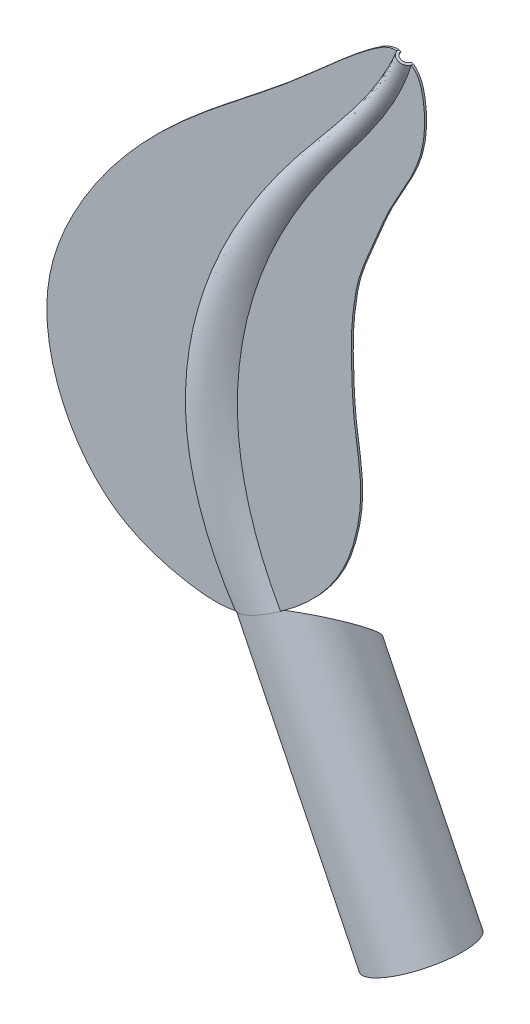
ISO-10303-21;
HEADER;
FILE_DESCRIPTION(('STEP AP214'),'2;1');
FILE_NAME('part.step','',(''),(''),'','','');
FILE_SCHEMA(('AUTOMOTIVE_DESIGN { 1 0 10303 214 1 1 1 1 }'));
ENDSEC;
DATA;
#1=APPLICATION_CONTEXT('core data for automotive mechanical design processes');
#2=APPLICATION_PROTOCOL_DEFINITION('international standard','automotive_design',2000,#1);
#3=PRODUCT_CONTEXT('',#1,'mechanical');
#4=PRODUCT('Part','Part','',(#3));
#5=PRODUCT_RELATED_PRODUCT_CATEGORY('part','',(#4));
#6=PRODUCT_DEFINITION_FORMATION('','',#4);
#7=PRODUCT_DEFINITION_CONTEXT('part definition',#1,'design');
#8=PRODUCT_DEFINITION('design','',#6,#7);
#9=PRODUCT_DEFINITION_SHAPE('','',#8);
#10=(LENGTH_UNIT() NAMED_UNIT(*) SI_UNIT(.MILLI.,.METRE.));
#11=(NAMED_UNIT(*) PLANE_ANGLE_UNIT() SI_UNIT($,.RADIAN.));
#12=(NAMED_UNIT(*) SI_UNIT($,.STERADIAN.) SOLID_ANGLE_UNIT());
#13=UNCERTAINTY_MEASURE_WITH_UNIT(LENGTH_MEASURE(1.E-05),#10,'distance_accuracy_value','');
#14=(GEOMETRIC_REPRESENTATION_CONTEXT(3) GLOBAL_UNCERTAINTY_ASSIGNED_CONTEXT((#13)) GLOBAL_UNIT_ASSIGNED_CONTEXT((#10,
#11,#12)) REPRESENTATION_CONTEXT('',''));
#15=CARTESIAN_POINT('',(0.,0.,0.));
#16=DIRECTION('',(0.,0.,1.));
#17=DIRECTION('',(1.,0.,0.));
#18=AXIS2_PLACEMENT_3D('',#15,#16,#17);
#19=CARTESIAN_POINT('',(1.71023676879806,91.0927998577119,-9.45862081054178));
#20=DIRECTION('',(0.439516642205836,-0.898234446692013,0.));
#21=DIRECTION('',(0.898234446692013,0.439516642205836,0.));
#22=AXIS2_PLACEMENT_3D('',#19,#20,#21);
#23=PLANE('',#22);
#24=CARTESIAN_POINT('',(1.71023676879806,91.0927998577119,-9.45862081054178));
#25=DIRECTION('',(0.439516642205836,-0.898234446692013,0.));
#26=DIRECTION('',(0.898234446692013,0.439516642205836,0.));
#27=AXIS2_PLACEMENT_3D('',#24,#25,#26);
#28=CIRCLE('',#27,11.6091216226183);
#29=CARTESIAN_POINT('',(7.75624190087267,94.0511810289027,0.));
#30=VERTEX_POINT('',#29);
#31=CARTESIAN_POINT('',(7.39283785826073,93.873363171704,0.275248788115344));
#32=VERTEX_POINT('',#31);
#33=EDGE_CURVE('E179',#30,#32,#28,.T.);
#34=ORIENTED_EDGE('',*,*,#33,.F.);
#35=DIRECTION('',(-0.898234446692013,-0.439516642205836,0.));
#36=VECTOR('',#35,1.);
#37=CARTESIAN_POINT('',(90.7586367294848,134.665225618782,0.));
#38=LINE('',#37,#36);
#39=CARTESIAN_POINT('',(7.39283785378464,93.8733631695138,0.));
#40=VERTEX_POINT('',#39);
#41=EDGE_CURVE('E186',#30,#40,#38,.T.);
#42=ORIENTED_EDGE('',*,*,#41,.T.);
#43=DIRECTION('',(0.,0.,1.));
#44=VECTOR('',#43,1.);
#45=CARTESIAN_POINT('',(7.39283785826074,93.873363171704,0.));
#46=LINE('',#45,#44);
#47=EDGE_CURVE('E197',#40,#32,#46,.T.);
#48=ORIENTED_EDGE('',*,*,#47,.T.);
#49=EDGE_LOOP('',(#34,#42,#48));
#50=FACE_BOUND('',#49,.T.);
#51=ADVANCED_FACE('F104',(#50),#23,.F.);
#52=CARTESIAN_POINT('',(-35.6320594824707,72.820776644778,0.));
#53=DIRECTION('',(0.439516642205836,-0.898234446692013,0.));
#54=DIRECTION('',(0.898234446692013,0.439516642205836,0.));
#55=AXIS2_PLACEMENT_3D('',#52,#53,#54);
#56=PLANE('',#55);
#57=DIRECTION('',(0.,0.,-1.));
#58=VECTOR('',#57,1.);
#59=CARTESIAN_POINT('',(-3.9723643206645,88.3122365437197,0.));
#60=LINE('',#59,#58);
#61=CARTESIAN_POINT('',(-3.97236432066456,88.3122365437197,0.500000000000034));
#62=VERTEX_POINT('',#61);
#63=CARTESIAN_POINT('',(-3.9723643206645,88.3122365437197,0.275248788115415));
#64=VERTEX_POINT('',#63);
#65=EDGE_CURVE('E410',#62,#64,#60,.T.);
#66=ORIENTED_EDGE('',*,*,#65,.T.);
#67=EDGE_CURVE('E201',#32,#64,#28,.T.);
#68=ORIENTED_EDGE('',*,*,#67,.F.);
#69=CARTESIAN_POINT('',(7.39283785826068,93.873363171704,0.50000000000005));
#70=VERTEX_POINT('',#69);
#71=EDGE_CURVE('E231',#32,#70,#46,.T.);
#72=ORIENTED_EDGE('',*,*,#71,.T.);
#73=CARTESIAN_POINT('',(1.71023676879807,91.0927998577119,-9.34405469895049));
#74=DIRECTION('',(0.439516642205836,-0.898234446692013,0.));
#75=DIRECTION('',(0.898234446692013,0.439516642205836,0.));
#76=AXIS2_PLACEMENT_3D('',#73,#74,#75);
#77=CIRCLE('',#76,11.7016622922135);
#78=EDGE_CURVE('E253',#70,#62,#77,.T.);
#79=ORIENTED_EDGE('',*,*,#78,.T.);
#80=EDGE_LOOP('',(#66,#68,#72,#79));
#81=FACE_BOUND('',#80,.T.);
#82=ADVANCED_FACE('F368',(#81),#56,.T.);
#83=CARTESIAN_POINT('',(18.1526389048694,217.653213219474,0.));
#84=DIRECTION('',(0.,0.,1.));
#85=DIRECTION('',(1.,0.,0.));
#86=AXIS2_PLACEMENT_3D('',#83,#84,#85);
#87=PLANE('',#86);
#88=DIRECTION('',(0.898234446692013,0.439516642205836,0.));
#89=VECTOR('',#88,1.);
#90=CARTESIAN_POINT('',(-35.6320594824707,72.820776644778,0.));
#91=LINE('',#90,#89);
#92=CARTESIAN_POINT('',(6.94372063491476,93.6536048506011,0.));
#93=VERTEX_POINT('',#92);
#94=EDGE_CURVE('E191',#93,#40,#91,.T.);
#95=ORIENTED_EDGE('',*,*,#94,.F.);
#96=CARTESIAN_POINT('',(6.9437206349147,93.6536048506011,0.));
#97=CARTESIAN_POINT('',(5.41473395810933,96.3545809820254,0.));
#98=CARTESIAN_POINT('',(1.24194154709839,104.707541272413,1.44641660090207E-13));
#99=CARTESIAN_POINT('',(-2.49634591720829,116.679375194456,2.37172736428908E-13));
#100=CARTESIAN_POINT('',(-4.42143577962569,132.163197025344,3.52836581852284E-13));
#101=CARTESIAN_POINT('',(-3.34558290588977,147.844061243657,4.68462871494197E-13));
#102=CARTESIAN_POINT('',(1.85817524431581,166.029164092732,6.07231319166151E-13));
#103=CARTESIAN_POINT('',(10.1097099710725,182.747803811294,7.46009155783471E-13));
#104=CARTESIAN_POINT('',(18.8175917292774,195.677660467372,8.61710556988309E-13));
#105=CARTESIAN_POINT('',(28.2324327476993,208.012194035582,9.773978747751E-13));
#106=CARTESIAN_POINT('',(34.4172254584816,216.784470937884,1.05837899722585E-12));
#107=CARTESIAN_POINT('',(38.2925567593176,225.081245171922,1.12777730447988E-12));
#108=CARTESIAN_POINT('',(39.3660267458507,228.004631883273,1.15091476803724E-12));
#109=CARTESIAN_POINT('',(39.8290754678166,229.480921643533,1.16248349981591E-12));
#110=B_SPLINE_CURVE_WITH_KNOTS('',3,(#96,#97,#98,#99,#100,#101,#102,#103,#104,#105,#106,#107,
#108,#109),.UNSPECIFIED.,.F.,.F.,(4,1,1,1,1,1,1,1,1,1,1,4),(0.,0.0625,0.1875,0.25,0.375,
0.499898531977178,0.624923898982884,0.749949265988589,0.8125,0.937487316497147,
0.968743658248574,1.),.UNSPECIFIED.);
#111=CARTESIAN_POINT('',(39.8290754678166,229.480921643533,1.16248349981591E-12));
#112=VERTEX_POINT('',#111);
#113=EDGE_CURVE('E241',#112,#93,#110,.F.);
#114=ORIENTED_EDGE('',*,*,#113,.F.);
#115=DIRECTION('',(-0.939366733979565,0.342914186193229,0.));
#116=VECTOR('',#115,1.);
#117=CARTESIAN_POINT('',(40.2987588348063,229.309464550437,0.));
#118=LINE('',#117,#116);
#119=CARTESIAN_POINT('',(40.2987588884533,229.309464510191,0.));
#120=VERTEX_POINT('',#119);
#121=EDGE_CURVE('E366',#120,#112,#118,.T.);
#122=ORIENTED_EDGE('',*,*,#121,.F.);
#123=CARTESIAN_POINT('',(-3.97236432066451,88.3122365437197,0.));
#124=CARTESIAN_POINT('',(0.0835084057310594,89.1900810170922,0.));
#125=CARTESIAN_POINT('',(11.0213808384203,95.5353269658342,0.));
#126=CARTESIAN_POINT('',(21.9576734377895,106.378915959256,0.));
#127=CARTESIAN_POINT('',(26.4780846819235,119.575989795111,0.));
#128=CARTESIAN_POINT('',(27.9632290482625,128.392364103159,0.));
#129=CARTESIAN_POINT('',(27.0292993226862,137.517591070725,0.));
#130=CARTESIAN_POINT('',(25.6538800577086,145.658760462885,0.));
#131=CARTESIAN_POINT('',(25.2658226417589,155.050759971534,0.));
#132=CARTESIAN_POINT('',(24.9926379538767,162.930912241937,0.));
#133=CARTESIAN_POINT('',(25.871682132877,170.086342226938,0.));
#134=CARTESIAN_POINT('',(26.8815903040995,177.049885165787,0.));
#135=CARTESIAN_POINT('',(30.719887523617,185.097493097323,0.));
#136=CARTESIAN_POINT('',(34.608540075814,195.450511590628,0.));
#137=CARTESIAN_POINT('',(39.5751521784441,203.079883121232,0.));
#138=CARTESIAN_POINT('',(42.7634298561079,210.557224289062,0.));
#139=CARTESIAN_POINT('',(43.7769597250773,216.669640915734,0.));
#140=CARTESIAN_POINT('',(43.5371616425588,222.776107870919,0.));
#141=CARTESIAN_POINT('',(42.1271190617327,228.764345056572,0.));
#142=CARTESIAN_POINT('',(36.018113251844,231.663027755294,0.));
#143=CARTESIAN_POINT('',(29.3034744520608,227.213853019865,0.));
#144=CARTESIAN_POINT('',(21.0611956265141,220.350444736864,0.));
#145=CARTESIAN_POINT('',(6.03291939901175,206.619219690843,0.));
#146=CARTESIAN_POINT('',(-18.745935465649,188.747565485561,0.));
#147=CARTESIAN_POINT('',(-41.6770805771715,163.49811028959,0.));
#148=CARTESIAN_POINT('',(-53.9505634180973,133.903950419937,0.));
#149=CARTESIAN_POINT('',(-48.4412005163846,109.979062643897,0.));
#150=CARTESIAN_POINT('',(-34.3894596578642,93.4127484566212,0.));
#151=CARTESIAN_POINT('',(-18.3876763460696,88.3977441064224,0.));
#152=CARTESIAN_POINT('',(-7.90293042245715,87.4615131698751,0.));
#153=CARTESIAN_POINT('',(-3.97236432066451,88.3122365437197,0.));
#154=B_SPLINE_CURVE_WITH_KNOTS('',3,(#123,#124,#125,#126,#127,#128,#129,#130,#131,#132,#133,
#134,#135,#136,#137,#138,#139,#140,#141,#142,#143,#144,#145,#146,#147,#148,#149,#150,#151,#152,
#153),.UNSPECIFIED.,.T.,.F.,(4,1,1,1,1,1,1,1,1,1,1,1,1,1,1,1,1,1,1,1,1,1,1,1,1,1,1,1,4),(0.,
0.0340243763582733,0.0988763297607311,0.118907677478479,0.145786062529137,0.170286406352009,
0.192462457471315,0.212381064659587,0.246064292787529,0.255799531100637,0.270542838998359,
0.302555902042624,0.326969861183771,0.359688752491897,0.375550629104661,0.392265066976641,
0.408966518276035,0.425441242525256,0.438507929679372,0.456211432649759,0.484640685623077,
0.527742356255112,0.618785571803741,0.731634369678768,0.798927425070733,0.868192529540393,
0.917781462234963,0.967026810412931,1.),.UNSPECIFIED.);
#155=EDGE_CURVE('E409',#40,#120,#154,.T.);
#156=ORIENTED_EDGE('',*,*,#155,.F.);
#157=EDGE_LOOP('',(#95,#114,#122,#156));
#158=FACE_BOUND('',#157,.T.);
#159=ADVANCED_FACE('F377',(#158),#87,.F.);
#160=CARTESIAN_POINT('',(18.1526389048694,217.653213219474,0.5));
#161=DIRECTION('',(0.,0.,1.));
#162=DIRECTION('',(1.,0.,0.));
#163=AXIS2_PLACEMENT_3D('',#160,#161,#162);
#164=PLANE('',#163);
#165=CARTESIAN_POINT('',(7.39283785826068,93.873363171704,0.500000000000049));
#166=CARTESIAN_POINT('',(1.95170172899969,103.47520103635,0.5));
#167=CARTESIAN_POINT('',(-2.15269592452179,115.337754887318,0.5));
#168=CARTESIAN_POINT('',(-3.78743288323208,133.69323217994,0.5));
#169=CARTESIAN_POINT('',(-2.95945882534134,146.840599525724,0.5));
#170=CARTESIAN_POINT('',(3.49899202524205,170.553491291259,0.5));
#171=CARTESIAN_POINT('',(19.4443984325725,197.472204926412,0.5));
#172=CARTESIAN_POINT('',(36.3267385991195,216.645915282065,0.5));
#173=CARTESIAN_POINT('',(40.2987588348063,229.309464550437,0.5));
#174=B_SPLINE_CURVE_WITH_KNOTS('',3,(#165,#166,#167,#168,#169,#170,#171,#172,#173),
.UNSPECIFIED.,.F.,.F.,(4,1,1,1,1,1,4),(0.,0.224028164890013,0.247391799255593,0.372145457266583,
0.487607511807965,0.737136412327062,1.),.UNSPECIFIED.);
#175=CARTESIAN_POINT('',(40.2987588348063,229.309464550437,0.5));
#176=VERTEX_POINT('',#175);
#177=EDGE_CURVE('E432',#70,#176,#174,.T.);
#178=ORIENTED_EDGE('',*,*,#177,.F.);
#179=CARTESIAN_POINT('',(-3.97236432066451,88.3122365437197,0.5));
#180=CARTESIAN_POINT('',(0.0835084057310594,89.1900810170922,0.5));
#181=CARTESIAN_POINT('',(11.0213808384203,95.5353269658342,0.5));
#182=CARTESIAN_POINT('',(21.9576734377895,106.378915959256,0.5));
#183=CARTESIAN_POINT('',(26.4780846819235,119.575989795111,0.5));
#184=CARTESIAN_POINT('',(27.9632290482625,128.392364103159,0.5));
#185=CARTESIAN_POINT('',(27.0292993226862,137.517591070725,0.5));
#186=CARTESIAN_POINT('',(25.6538800577086,145.658760462885,0.5));
#187=CARTESIAN_POINT('',(25.2658226417589,155.050759971534,0.5));
#188=CARTESIAN_POINT('',(24.9926379538767,162.930912241937,0.5));
#189=CARTESIAN_POINT('',(25.871682132877,170.086342226938,0.5));
#190=CARTESIAN_POINT('',(26.8815903040995,177.049885165787,0.5));
#191=CARTESIAN_POINT('',(30.719887523617,185.097493097323,0.5));
#192=CARTESIAN_POINT('',(34.608540075814,195.450511590628,0.5));
#193=CARTESIAN_POINT('',(39.5751521784441,203.079883121232,0.5));
#194=CARTESIAN_POINT('',(42.7634298561079,210.557224289062,0.5));
#195=CARTESIAN_POINT('',(43.7769597250773,216.669640915734,0.5));
#196=CARTESIAN_POINT('',(43.5371616425588,222.776107870919,0.5));
#197=CARTESIAN_POINT('',(42.1271190617327,228.764345056572,0.5));
#198=CARTESIAN_POINT('',(36.018113251844,231.663027755294,0.5));
#199=CARTESIAN_POINT('',(29.3034744520608,227.213853019865,0.5));
#200=CARTESIAN_POINT('',(21.0611956265141,220.350444736864,0.5));
#201=CARTESIAN_POINT('',(6.03291939901175,206.619219690843,0.5));
#202=CARTESIAN_POINT('',(-18.745935465649,188.747565485561,0.5));
#203=CARTESIAN_POINT('',(-41.6770805771715,163.49811028959,0.5));
#204=CARTESIAN_POINT('',(-53.9505634180973,133.903950419937,0.5));
#205=CARTESIAN_POINT('',(-48.4412005163846,109.979062643897,0.5));
#206=CARTESIAN_POINT('',(-34.3894596578642,93.4127484566212,0.5));
#207=CARTESIAN_POINT('',(-18.3876763460696,88.3977441064224,0.5));
#208=CARTESIAN_POINT('',(-7.90293042245715,87.4615131698751,0.5));
#209=CARTESIAN_POINT('',(-3.97236432066451,88.3122365437197,0.5));
#210=B_SPLINE_CURVE_WITH_KNOTS('',3,(#179,#180,#181,#182,#183,#184,#185,#186,#187,#188,#189,
#190,#191,#192,#193,#194,#195,#196,#197,#198,#199,#200,#201,#202,#203,#204,#205,#206,#207,#208,
#209),.UNSPECIFIED.,.T.,.F.,(4,1,1,1,1,1,1,1,1,1,1,1,1,1,1,1,1,1,1,1,1,1,1,1,1,1,1,1,4),(0.,
0.0340243763582733,0.0988763297607311,0.118907677478479,0.145786062529137,0.170286406352009,
0.192462457471315,0.212381064659587,0.246064292787529,0.255799531100637,0.270542838998359,
0.302555902042624,0.326969861183771,0.359688752491897,0.375550629104661,0.392265066976641,
0.408966518276035,0.425441242525256,0.438507929679372,0.456211432649759,0.484640685623077,
0.527742356255112,0.618785571803741,0.731634369678768,0.798927425070733,0.868192529540393,
0.917781462234963,0.967026810412931,1.),.UNSPECIFIED.);
#211=EDGE_CURVE('E116',#70,#176,#210,.T.);
#212=ORIENTED_EDGE('',*,*,#211,.T.);
#213=EDGE_LOOP('',(#178,#212));
#214=FACE_BOUND('',#213,.T.);
#215=ADVANCED_FACE('F383',(#214),#164,.T.);
#216=DIRECTION('',(0.,0.,-1.));
#217=VECTOR('',#216,1.);
#218=SURFACE_OF_LINEAR_EXTRUSION('',#210,#217);
#219=DIRECTION('',(0.,0.,-1.));
#220=VECTOR('',#219,1.);
#221=CARTESIAN_POINT('',(40.2987588348063,229.309464550437,0.5));
#222=LINE('',#221,#220);
#223=EDGE_CURVE('E132',#176,#120,#222,.T.);
#224=ORIENTED_EDGE('',*,*,#223,.F.);
#225=ORIENTED_EDGE('',*,*,#211,.F.);
#226=ORIENTED_EDGE('',*,*,#71,.F.);
#227=ORIENTED_EDGE('',*,*,#47,.F.);
#228=ORIENTED_EDGE('',*,*,#155,.T.);
#229=EDGE_LOOP('',(#224,#225,#226,#227,#228));
#230=FACE_BOUND('',#229,.T.);
#231=ADVANCED_FACE('F106',(#230),#218,.F.);
#232=DIRECTION('',(0.,-1.11022302462516E-13,1.));
#233=VECTOR('',#232,1.);
#234=CARTESIAN_POINT('',(36.7057979215836,230.621068658837,0.));
#235=LINE('',#234,#233);
#236=CARTESIAN_POINT('',(36.7057979215836,230.621068658837,0.));
#237=VERTEX_POINT('',#236);
#238=CARTESIAN_POINT('',(36.7057979215836,230.621068658837,0.5));
#239=VERTEX_POINT('',#238);
#240=EDGE_CURVE('E396',#237,#239,#235,.T.);
#241=ORIENTED_EDGE('',*,*,#240,.F.);
#242=CARTESIAN_POINT('',(-3.97236432066453,88.3122365437198,0.));
#243=VERTEX_POINT('',#242);
#244=EDGE_CURVE('E593',#237,#243,#154,.T.);
#245=ORIENTED_EDGE('',*,*,#244,.T.);
#246=DIRECTION('',(0.,0.,-1.));
#247=VECTOR('',#246,1.);
#248=CARTESIAN_POINT('',(-3.9723643206645,88.3122365437197,0.5));
#249=LINE('',#248,#247);
#250=EDGE_CURVE('E213',#64,#243,#249,.T.);
#251=ORIENTED_EDGE('',*,*,#250,.F.);
#252=ORIENTED_EDGE('',*,*,#65,.F.);
#253=EDGE_CURVE('E406',#239,#62,#210,.T.);
#254=ORIENTED_EDGE('',*,*,#253,.F.);
#255=EDGE_LOOP('',(#241,#245,#251,#252,#254));
#256=FACE_BOUND('',#255,.T.);
#257=ADVANCED_FACE('F381',(#256),#218,.F.);
#258=CARTESIAN_POINT('',(36.7057979215836,230.621068658837,0.5));
#259=CARTESIAN_POINT('',(31.0799627994331,217.336154588316,0.5));
#260=CARTESIAN_POINT('',(12.3708014878055,197.997819932966,0.5));
#261=CARTESIAN_POINT('',(-6.76999517409408,169.508411826677,0.5));
#262=CARTESIAN_POINT('',(-15.2768659520018,144.842235577833,0.5));
#263=CARTESIAN_POINT('',(-16.8717890563648,130.737424532348,0.5));
#264=CARTESIAN_POINT('',(-15.5630156941021,110.964585378096,0.5));
#265=CARTESIAN_POINT('',(-10.5391912348823,98.1570283038052,0.5));
#266=CARTESIAN_POINT('',(-3.97236432066456,88.3122365437197,0.500000000000037));
#267=B_SPLINE_CURVE_WITH_KNOTS('',3,(#258,#259,#260,#261,#262,#263,#264,#265,#266),
.UNSPECIFIED.,.F.,.F.,(4,1,1,1,1,1,4),(0.,0.262863587672938,0.512392488192035,0.627854542733417,
0.752608200744407,0.775971835109986,1.),.UNSPECIFIED.);
#268=EDGE_CURVE('E272',#239,#62,#267,.T.);
#269=ORIENTED_EDGE('',*,*,#268,.F.);
#270=ORIENTED_EDGE('',*,*,#253,.T.);
#271=EDGE_LOOP('',(#269,#270));
#272=FACE_BOUND('',#271,.T.);
#273=ADVANCED_FACE('F378',(#272),#164,.T.);
#274=CARTESIAN_POINT('',(37.1754812885733,230.44961156574,0.));
#275=VERTEX_POINT('',#274);
#276=EDGE_CURVE('E247',#275,#237,#118,.T.);
#277=ORIENTED_EDGE('',*,*,#276,.F.);
#278=CARTESIAN_POINT('',(-3.52324709731856,88.5319948648226,0.));
#279=CARTESIAN_POINT('',(-5.35437250467209,91.2781092925861,0.));
#280=CARTESIAN_POINT('',(-10.3275530704669,99.8445249750385,1.41152548245033E-13));
#281=CARTESIAN_POINT('',(-14.7751627356351,112.569480136111,2.34472830983118E-13));
#282=CARTESIAN_POINT('',(-16.5834306173817,129.027601468996,3.51123184405725E-13));
#283=CARTESIAN_POINT('',(-14.6032081958552,145.634157674095,4.67735661730017E-13));
#284=CARTESIAN_POINT('',(-7.87355453767895,164.352575211917,6.07687678763409E-13));
#285=CARTESIAN_POINT('',(2.10549464154312,181.831702356315,7.4764916482138E-13));
#286=CARTESIAN_POINT('',(12.2130840799703,195.26472141745,8.64337394342301E-13));
#287=CARTESIAN_POINT('',(22.9056877816002,207.93596847194,9.81011420326354E-13));
#288=CARTESIAN_POINT('',(30.0863009512381,217.005735529305,1.06268323851519E-12));
#289=CARTESIAN_POINT('',(35.0370069991375,225.758781714173,1.13267345056876E-12));
#290=CARTESIAN_POINT('',(36.5092855940238,228.875014993461,1.15600825576557E-12));
#291=CARTESIAN_POINT('',(37.1754812885734,230.44961156574,1.16767565836397E-12));
#292=B_SPLINE_CURVE_WITH_KNOTS('',3,(#278,#279,#280,#281,#282,#283,#284,#285,#286,#287,#288,
#289,#290,#291),.UNSPECIFIED.,.F.,.F.,(4,1,1,1,1,1,1,1,1,1,1,4),(0.,0.0625,0.1875,0.25,0.375,
0.499898531977178,0.624923898982884,0.749949265988589,0.8125,0.937487316497147,
0.968743658248574,1.),.UNSPECIFIED.);
#293=CARTESIAN_POINT('',(-3.52324709731856,88.5319948648226,0.));
#294=VERTEX_POINT('',#293);
#295=EDGE_CURVE('E124',#294,#275,#292,.T.);
#296=ORIENTED_EDGE('',*,*,#295,.F.);
#297=EDGE_CURVE('E225',#243,#294,#91,.T.);
#298=ORIENTED_EDGE('',*,*,#297,.F.);
#299=ORIENTED_EDGE('',*,*,#244,.F.);
#300=EDGE_LOOP('',(#277,#296,#298,#299));
#301=FACE_BOUND('',#300,.T.);
#302=ADVANCED_FACE('F246',(#301),#87,.F.);
#303=CARTESIAN_POINT('',(78.604401070374,215.326056730394,1.09085519881499E-12));
#304=DIRECTION('',(0.342914186193217,0.93936673397957,0.));
#305=DIRECTION('',(-0.93936673397957,0.342914186193217,0.));
#306=AXIS2_PLACEMENT_3D('',#303,#304,#305);
#307=PLANE('',#306);
#308=CARTESIAN_POINT('',(38.502278378195,229.965266604637,-0.12507130457977));
#309=DIRECTION('',(0.342914186193217,0.93936673397957,0.));
#310=DIRECTION('',(-0.93936673397957,0.342914186193217,0.));
#311=AXIS2_PLACEMENT_3D('',#308,#309,#310);
#312=CIRCLE('',#311,1.41796452339407);
#313=EDGE_CURVE('E249',#275,#112,#312,.T.);
#314=ORIENTED_EDGE('',*,*,#313,.F.);
#315=ORIENTED_EDGE('',*,*,#276,.T.);
#316=ORIENTED_EDGE('',*,*,#240,.T.);
#317=CARTESIAN_POINT('',(38.502278378195,229.965266604637,0.0308605449068251));
#318=DIRECTION('',(0.342914186193217,0.93936673397957,0.));
#319=DIRECTION('',(-0.93936673397957,0.342914186193217,0.));
#320=AXIS2_PLACEMENT_3D('',#317,#318,#319);
#321=CIRCLE('',#320,1.96913945509317);
#322=EDGE_CURVE('E333',#239,#176,#321,.T.);
#323=ORIENTED_EDGE('',*,*,#322,.T.);
#324=ORIENTED_EDGE('',*,*,#223,.T.);
#325=ORIENTED_EDGE('',*,*,#121,.T.);
#326=EDGE_LOOP('',(#314,#315,#316,#323,#324,#325));
#327=FACE_BOUND('',#326,.T.);
#328=ADVANCED_FACE('F305',(#327),#307,.T.);
#329=CARTESIAN_POINT('',(-3.97236432066456,88.3122365437197,0.500000000000037));
#330=CARTESIAN_POINT('',(-10.5391912348823,98.1570283038052,0.5));
#331=CARTESIAN_POINT('',(-15.5630156941021,110.964585378096,0.5));
#332=CARTESIAN_POINT('',(-16.8717890563648,130.737424532348,0.5));
#333=CARTESIAN_POINT('',(-15.2768659520018,144.842235577833,0.5));
#334=CARTESIAN_POINT('',(-6.76999517409408,169.508411826677,0.5));
#335=CARTESIAN_POINT('',(12.3708014878055,197.997819932966,0.5));
#336=CARTESIAN_POINT('',(31.0799627994331,217.336154588316,0.5));
#337=CARTESIAN_POINT('',(36.7057979215836,230.621068658837,0.5));
#338=CARTESIAN_POINT('',(-3.53972545179247,88.5239318128498,0.809541779264035));
#339=CARTESIAN_POINT('',(-10.0639855195755,98.3627938304386,0.80286259202201));
#340=CARTESIAN_POINT('',(-15.054289758823,111.135606425044,0.795486840182185));
#341=CARTESIAN_POINT('',(-16.3838492600288,130.856354616005,0.784391676359552));
#342=CARTESIAN_POINT('',(-14.8259849691314,144.926205825498,0.776533308140315));
#343=CARTESIAN_POINT('',(-6.41394593290178,169.561828877558,0.761932037031993));
#344=CARTESIAN_POINT('',(12.5815549022846,197.997543498566,0.743213149370223));
#345=CARTESIAN_POINT('',(31.2046793171377,217.338609718747,0.727936653347044));
#346=CARTESIAN_POINT('',(36.756516738793,230.602553843165,0.720099624810788));
#347=CARTESIAN_POINT('',(-2.64376429761094,88.962336106387,1.35123989297603));
#348=CARTESIAN_POINT('',(-9.08021503990424,98.7864042948664,1.33454675960632));
#349=CARTESIAN_POINT('',(-14.0005241680014,111.486487566681,1.31611271895092));
#350=CARTESIAN_POINT('',(-15.3672113071728,131.098179431301,1.28838284063799));
#351=CARTESIAN_POINT('',(-13.8803166394769,145.094658579215,1.26874260837633));
#352=CARTESIAN_POINT('',(-5.65209192624,169.662760512021,1.23224999974788));
#353=CARTESIAN_POINT('',(13.0603159023806,197.982864458612,1.185466330276));
#354=CARTESIAN_POINT('',(31.5174861741156,217.322682438553,1.14728614812253));
#355=CARTESIAN_POINT('',(36.9244676499925,230.541243656258,1.12769924962158));
#356=CARTESIAN_POINT('',(-1.23078487935462,89.6537234960658,1.93163072909603));
#357=CARTESIAN_POINT('',(-7.52830070938849,99.4485603346994,1.90743801428496));
#358=CARTESIAN_POINT('',(-12.3356431850443,112.031774759591,1.88072226964224));
#359=CARTESIAN_POINT('',(-13.7460267086946,131.468186598078,1.8405344257598));
#360=CARTESIAN_POINT('',(-12.3570907295649,145.346324059547,1.8120705941108));
#361=CARTESIAN_POINT('',(-4.38880194704859,169.797752949837,1.75918326291254));
#362=CARTESIAN_POINT('',(13.9192035144679,197.92470909538,1.69138149386883));
#363=CARTESIAN_POINT('',(32.1439581164795,217.246551589169,1.6360484274027));
#364=CARTESIAN_POINT('',(37.3421283494186,230.388777347129,1.60766189031752));
#365=CARTESIAN_POINT('',(0.228219663557713,90.3676315186599,2.27986523076803));
#366=CARTESIAN_POINT('',(-5.92525313202653,100.128435882711,2.25318232494709));
#367=CARTESIAN_POINT('',(-10.6139881129832,112.58947963228,2.22371669019693));
#368=CARTESIAN_POINT('',(-12.0595826395123,131.842636033323,2.17939225361195));
#369=CARTESIAN_POINT('',(-10.7625954103702,145.596783066265,2.14799859874004));
#370=CARTESIAN_POINT('',(-3.04307576922556,169.921043247222,2.08966749830322));
#371=CARTESIAN_POINT('',(14.8748431935668,197.841396105093,2.01488679543401));
#372=CARTESIAN_POINT('',(32.8788653150659,217.134282081614,1.95385821667261));
#373=CARTESIAN_POINT('',(37.8742179234404,230.19453897711,1.9225498124054));
#374=CARTESIAN_POINT('',(1.71023676879806,91.0927998577118,2.39594339799203));
#375=CARTESIAN_POINT('',(-4.29374475294132,100.816114670077,2.36926774427403));
#376=CARTESIAN_POINT('',(-8.85785580931194,113.151170132707,2.33981011794011));
#377=CARTESIAN_POINT('',(-10.3296109697984,132.215328356144,2.2954977282206));
#378=CARTESIAN_POINT('',(-9.11816238867155,145.841417551779,2.26411260577835));
#379=CARTESIAN_POINT('',(-1.635501574426,170.030951558968,2.20579735905505));
#380=CARTESIAN_POINT('',(15.9075999601891,197.735012429689,2.13103698070967));
#381=CARTESIAN_POINT('',(33.7033506992763,216.99103493519,2.07002498880498));
#382=CARTESIAN_POINT('',(38.502278378195,229.965266604637,2.0387250937973));
#383=CARTESIAN_POINT('',(3.19225387403841,91.8179681967637,2.27986523076803));
#384=CARTESIAN_POINT('',(-2.66223637385612,101.503793457444,2.25318232494709));
#385=CARTESIAN_POINT('',(-7.10172350564067,113.712860633133,2.22371669019693));
#386=CARTESIAN_POINT('',(-8.59963930008462,132.588020678965,2.17939225361195));
#387=CARTESIAN_POINT('',(-7.47372936697293,146.086052037292,2.14799859874004));
#388=CARTESIAN_POINT('',(-0.227927379626524,170.140859870714,2.08966749830322));
#389=CARTESIAN_POINT('',(16.9403567268112,197.628628754285,2.014886795434));
#390=CARTESIAN_POINT('',(34.5278360834866,216.847787788767,1.95385821667261));
#391=CARTESIAN_POINT('',(39.1303388329495,229.735994232163,1.92254981240539));
#392=CARTESIAN_POINT('',(4.65125841695075,92.531876219358,1.93163072909603));
#393=CARTESIAN_POINT('',(-1.05918879649415,102.183669005456,1.90743801428496));
#394=CARTESIAN_POINT('',(-5.38006843357955,114.270565505823,1.88072226964224));
#395=CARTESIAN_POINT('',(-6.91319523090232,132.96247011421,1.8405344257598));
#396=CARTESIAN_POINT('',(-5.87923404777826,146.33651104401,1.8120705941108));
#397=CARTESIAN_POINT('',(1.11779879819653,170.264150168099,1.75918326291254));
#398=CARTESIAN_POINT('',(17.8959964059101,197.545315763999,1.69138149386883));
#399=CARTESIAN_POINT('',(35.2627432820731,216.735518281212,1.63604842740271));
#400=CARTESIAN_POINT('',(39.6624284069714,229.541755862145,1.60766189031753));
#401=CARTESIAN_POINT('',(6.06423783520707,93.2232636090368,1.35123989297604));
#402=CARTESIAN_POINT('',(0.492725534021604,102.845825045289,1.33454675960632));
#403=CARTESIAN_POINT('',(-3.71518745062246,114.815852698733,1.31611271895092));
#404=CARTESIAN_POINT('',(-5.29201063242405,133.332477280986,1.28838284063799));
#405=CARTESIAN_POINT('',(-4.35600813786625,146.588176524342,1.26874260837633));
#406=CARTESIAN_POINT('',(2.38108877738798,170.399142605915,1.23224999974788));
#407=CARTESIAN_POINT('',(18.7548840179975,197.487160400765,1.185466330276));
#408=CARTESIAN_POINT('',(35.889215224437,216.659387431828,1.14728614812253));
#409=CARTESIAN_POINT('',(40.0800891063975,229.389289553016,1.12769924962158));
#410=CARTESIAN_POINT('',(6.96019898938859,93.6616679025739,0.809541779264046));
#411=CARTESIAN_POINT('',(1.47649601369289,103.269435509716,0.80286259202201));
#412=CARTESIAN_POINT('',(-2.66142185980085,115.16673384037,0.795486840182185));
#413=CARTESIAN_POINT('',(-4.27537267956811,133.574302096283,0.784391676359552));
#414=CARTESIAN_POINT('',(-3.41033980821174,146.756629278059,0.776533308140315));
#415=CARTESIAN_POINT('',(3.14294278404974,170.500074240378,0.761932037031993));
#416=CARTESIAN_POINT('',(19.2336450180935,197.472481360812,0.743213149370223));
#417=CARTESIAN_POINT('',(36.2020220814149,216.643460151634,0.727936653347044));
#418=CARTESIAN_POINT('',(40.248040017597,229.327979366109,0.720099624810788));
#419=CARTESIAN_POINT('',(7.39283785826068,93.873363171704,0.500000000000049));
#420=CARTESIAN_POINT('',(1.95170172899969,103.47520103635,0.5));
#421=CARTESIAN_POINT('',(-2.15269592452179,115.337754887318,0.5));
#422=CARTESIAN_POINT('',(-3.78743288323208,133.69323217994,0.5));
#423=CARTESIAN_POINT('',(-2.95945882534134,146.840599525724,0.5));
#424=CARTESIAN_POINT('',(3.49899202524205,170.553491291259,0.5));
#425=CARTESIAN_POINT('',(19.4443984325725,197.472204926412,0.5));
#426=CARTESIAN_POINT('',(36.3267385991195,216.645915282065,0.5));
#427=CARTESIAN_POINT('',(40.2987588348063,229.309464550437,0.5));
#428=B_SPLINE_SURFACE_WITH_KNOTS('',3,3,((#329,#330,#331,#332,#333,#334,#335,#336,#337),(#338,
#339,#340,#341,#342,#343,#344,#345,#346),(#347,#348,#349,#350,#351,#352,#353,#354,#355),(#356,
#357,#358,#359,#360,#361,#362,#363,#364),(#365,#366,#367,#368,#369,#370,#371,#372,#373),(#374,
#375,#376,#377,#378,#379,#380,#381,#382),(#383,#384,#385,#386,#387,#388,#389,#390,#391),(#392,
#393,#394,#395,#396,#397,#398,#399,#400),(#401,#402,#403,#404,#405,#406,#407,#408,#409),(#410,
#411,#412,#413,#414,#415,#416,#417,#418),(#419,#420,#421,#422,#423,#424,#425,#426,#427)),
.UNSPECIFIED.,.F.,.F.,.F.,(4,1,1,1,1,1,1,1,4),(4,1,1,1,1,1,4),(0.,0.125,0.25,0.375,0.5,0.625,
0.75,0.875,1.),(0.,0.224028164890013,0.247391799255593,0.372145457266583,0.487607511807965,
0.737136412327062,1.),.UNSPECIFIED.);
#429=ORIENTED_EDGE('',*,*,#78,.F.);
#430=ORIENTED_EDGE('',*,*,#177,.T.);
#431=ORIENTED_EDGE('',*,*,#322,.F.);
#432=ORIENTED_EDGE('',*,*,#268,.T.);
#433=EDGE_LOOP('',(#429,#430,#431,#432));
#434=FACE_BOUND('',#433,.T.);
#435=ADVANCED_FACE('F293',(#434),#428,.T.);
#436=CARTESIAN_POINT('',(-3.52324709731856,88.5319948648227,0.));
#437=CARTESIAN_POINT('',(-5.35437250467209,91.2781092925861,0.));
#438=CARTESIAN_POINT('',(-10.3275530704669,99.8445249750385,1.41152548245033E-13));
#439=CARTESIAN_POINT('',(-14.7751627356351,112.569480136111,2.34472830983118E-13));
#440=CARTESIAN_POINT('',(-16.5834306173817,129.027601468996,3.51123184405725E-13));
#441=CARTESIAN_POINT('',(-14.6032081958552,145.634157674095,4.67735661730017E-13));
#442=CARTESIAN_POINT('',(-7.87355453767895,164.352575211917,6.07687678763409E-13));
#443=CARTESIAN_POINT('',(2.10549464154312,181.831702356315,7.4764916482138E-13));
#444=CARTESIAN_POINT('',(12.2130840799703,195.26472141745,8.64337394342301E-13));
#445=CARTESIAN_POINT('',(22.9056877816002,207.93596847194,9.81011420326354E-13));
#446=CARTESIAN_POINT('',(30.0863009512381,217.005735529305,1.06268323851519E-12));
#447=CARTESIAN_POINT('',(35.0370069991375,225.758781714173,1.13267345056876E-12));
#448=CARTESIAN_POINT('',(36.5092855940238,228.875014993461,1.15600825576557E-12));
#449=CARTESIAN_POINT('',(37.1754812885734,230.44961156574,1.16765863471258E-12));
#450=CARTESIAN_POINT('',(-3.12218757049562,88.7282379917736,0.275037872265417));
#451=CARTESIAN_POINT('',(-4.9419799627316,91.4735543060623,0.273117275482541));
#452=CARTESIAN_POINT('',(-9.88557931804295,100.034323960464,0.267355485133901));
#453=CARTESIAN_POINT('',(-14.3086582861298,112.732229665402,0.259673098002381));
#454=CARTESIAN_POINT('',(-16.1280742436809,129.155168430067,0.250070114087981));
#455=CARTESIAN_POINT('',(-14.1918123406605,145.728565622412,0.240470248240112));
#456=CARTESIAN_POINT('',(-7.53327272446869,164.431256289856,0.22894900609273));
#457=CARTESIAN_POINT('',(2.36626111359965,181.88519147258,0.217426984428716));
#458=CARTESIAN_POINT('',(12.4092468661462,195.302660435537,0.207820882447785));
#459=CARTESIAN_POINT('',(23.0423286881608,207.965292104338,0.198215949741803));
#460=CARTESIAN_POINT('',(30.1770521012093,217.026453778609,0.191492496847615));
#461=CARTESIAN_POINT('',(35.0791825720151,225.763736578811,0.185730706498975));
#462=CARTESIAN_POINT('',(36.5335877879903,228.873017453016,0.183809719957779));
#463=CARTESIAN_POINT('',(37.1906908485675,230.444059342419,0.182849226687181));
#464=CARTESIAN_POINT('',(-2.29377042033464,89.1335922125178,0.756354148729822));
#465=CARTESIAN_POINT('',(-4.09012165480029,91.876561256715,0.751582397833888));
#466=CARTESIAN_POINT('',(-8.97223320653899,100.423785725588,0.737267145146076));
#467=CARTESIAN_POINT('',(-13.343150270322,113.064588345686,0.718180141562327));
#468=CARTESIAN_POINT('',(-15.1809867418057,129.413406758202,0.69432138708264));
#469=CARTESIAN_POINT('',(-13.328771496532,145.91673192864,0.670470379485015));
#470=CARTESIAN_POINT('',(-6.80781014290533,164.583463510955,0.641845684270937));
#471=CARTESIAN_POINT('',(2.93734314886183,181.982509121134,0.613219052336344));
#472=CARTESIAN_POINT('',(12.8549984257339,195.365121452711,0.589352550974596));
#473=CARTESIAN_POINT('',(23.3729129127008,208.006766372355,0.565488954693621));
#474=CARTESIAN_POINT('',(30.4185703094984,217.048088095995,0.548784437296939));
#475=CARTESIAN_POINT('',(35.225875008723,225.751590997437,0.534469184609127));
#476=CARTESIAN_POINT('',(36.6453087517127,228.846215865921,0.529696465352932));
#477=CARTESIAN_POINT('',(37.2846141867631,230.409772791792,0.527310105724835));
#478=CARTESIAN_POINT('',(-0.991973977934255,89.7705764690295,1.2720501592274));
#479=CARTESIAN_POINT('',(-2.75107206116345,92.5082079514232,1.26520696013459));
#480=CARTESIAN_POINT('',(-7.53467766380038,101.029664672005,1.24467736285616));
#481=CARTESIAN_POINT('',(-11.818986212804,113.57754603818,1.21730456648492));
#482=CARTESIAN_POINT('',(-13.6739963822819,129.806100639141,1.18308857102087));
#483=CARTESIAN_POINT('',(-11.9373974461107,146.195237442707,1.14888368541092));
#484=CARTESIAN_POINT('',(-5.61025754538658,164.797132669324,1.10783282324464));
#485=CARTESIAN_POINT('',(3.9158717167208,182.102945455348,1.06677918361483));
#486=CARTESIAN_POINT('',(13.6559917483732,195.424186607206,1.03255207829667));
#487=CARTESIAN_POINT('',(24.0116144277902,208.025266276458,0.998329139173803));
#488=CARTESIAN_POINT('',(30.9309942367266,217.03046848549,0.974373081787794));
#489=CARTESIAN_POINT('',(35.6023345223221,225.677851568796,0.953843484509363));
#490=CARTESIAN_POINT('',(36.9714028948379,228.748675403366,0.946998896684789));
#491=CARTESIAN_POINT('',(37.5850578111005,230.300096371274,0.943576602772502));
#492=CARTESIAN_POINT('',(0.34926960923875,90.4268626758048,1.58146776552594));
#493=CARTESIAN_POINT('',(-1.37109594204892,93.1579144247684,1.57399356582344));
#494=CARTESIAN_POINT('',(-6.05175745346887,101.649876882179,1.55157096671592));
#495=CARTESIAN_POINT('',(-10.2435399648728,114.099868307924,1.5216741679059));
#496=CARTESIAN_POINT('',(-12.1083269288195,130.201948239197,1.48430316939337));
#497=CARTESIAN_POINT('',(-10.4799497999829,146.470687834409,1.44694430515709));
#498=CARTESIAN_POINT('',(-4.33775686924892,165.000295188056,1.40210820764925));
#499=CARTESIAN_POINT('',(4.9782234465504,182.205423128491,1.35726907657234));
#500=CARTESIAN_POINT('',(14.5482075382657,195.459080225844,1.31988594378356));
#501=CARTESIAN_POINT('',(24.7489368147566,208.013382526165,1.28250736134837));
#502=CARTESIAN_POINT('',(31.5472179190685,216.978116737611,1.25634235364374));
#503=CARTESIAN_POINT('',(36.08703193315,225.565653487899,1.23391975453622));
#504=CARTESIAN_POINT('',(37.4072146161166,228.611433864848,1.22644403804918));
#505=CARTESIAN_POINT('',(37.9959588540537,230.150097662939,1.22270617980566));
#506=CARTESIAN_POINT('',(1.71023676879807,91.0927998577118,1.68460696762546));
#507=CARTESIAN_POINT('',(0.0301807267186105,93.8163451373057,1.6771773795149));
#508=CARTESIAN_POINT('',(-4.54280576168425,102.276033123726,1.65488861518322));
#509=CARTESIAN_POINT('',(-8.6357543264217,114.624427665283,1.62517026274098));
#510=CARTESIAN_POINT('',(-10.5024331985037,130.59539924717,1.58802232218819));
#511=CARTESIAN_POINT('',(-8.9743955508725,146.739109458876,1.55088644348525));
#512=CARTESIAN_POINT('',(-3.00768964668162,165.190869652324,1.50631796120928));
#513=CARTESIAN_POINT('',(6.10760230630774,182.289753083804,1.46174646347085));
#514=CARTESIAN_POINT('',(15.5153379046238,195.471190942411,1.4245864610682));
#515=CARTESIAN_POINT('',(25.5690602646497,207.974081253761,1.38743098185925));
#516=CARTESIAN_POINT('',(32.2517632048598,216.895103233594,1.36142214641298));
#517=CARTESIAN_POINT('',(36.6647818792275,225.420013443047,1.3391333820813));
#518=CARTESIAN_POINT('',(37.9376561699371,228.439823438366,1.33170228623951));
#519=CARTESIAN_POINT('',(38.5022783781949,229.965266604636,1.32798673831861));
#520=CARTESIAN_POINT('',(3.07120392835739,91.7587370396189,1.58146776552595));
#521=CARTESIAN_POINT('',(1.43145739548616,94.4747758498431,1.57399356582344));
#522=CARTESIAN_POINT('',(-3.0338540698996,102.902189365273,1.55157096671592));
#523=CARTESIAN_POINT('',(-7.02796868797054,115.148987022643,1.5216741679059));
#524=CARTESIAN_POINT('',(-8.89653946818789,130.988850255143,1.48430316939337));
#525=CARTESIAN_POINT('',(-7.46884130176194,147.007531083343,1.44694430515709));
#526=CARTESIAN_POINT('',(-1.67762242411414,165.381444116593,1.40210820764925));
#527=CARTESIAN_POINT('',(7.23698116606528,182.374083039119,1.35726907657234));
#528=CARTESIAN_POINT('',(16.4824682709821,195.483301658979,1.31988594378356));
#529=CARTESIAN_POINT('',(26.389183714543,207.934779981359,1.28250736134837));
#530=CARTESIAN_POINT('',(32.9563084906513,216.812089729579,1.25634235364373));
#531=CARTESIAN_POINT('',(37.2425318253053,225.274373398197,1.23391975453622));
#532=CARTESIAN_POINT('',(38.468097723758,228.268213011887,1.22644403804918));
#533=CARTESIAN_POINT('',(39.0085979023363,229.780435546336,1.22270617980566));
#534=CARTESIAN_POINT('',(4.4124475155304,92.4150232463942,1.2720501592274));
#535=CARTESIAN_POINT('',(2.81143351460068,95.1244823231883,1.26520696013459));
#536=CARTESIAN_POINT('',(-1.55093385956811,103.522401575447,1.24467736285616));
#537=CARTESIAN_POINT('',(-5.45252244003938,115.671309292387,1.21730456648492));
#538=CARTESIAN_POINT('',(-7.3308700147256,131.384697855199,1.18308857102087));
#539=CARTESIAN_POINT('',(-6.01139365563426,147.282981475045,1.14888368541092));
#540=CARTESIAN_POINT('',(-0.405121747976633,165.584606635324,1.10783282324464));
#541=CARTESIAN_POINT('',(8.2993328958947,182.476560712261,1.06677918361483));
#542=CARTESIAN_POINT('',(17.3746840608745,195.518195277617,1.03255207829667));
#543=CARTESIAN_POINT('',(27.1265061015092,207.922896231064,0.998329139173799));
#544=CARTESIAN_POINT('',(33.5725321729929,216.759737981699,0.97437308178779));
#545=CARTESIAN_POINT('',(37.7272292361329,225.162175317299,0.953843484509359));
#546=CARTESIAN_POINT('',(38.9039094450364,228.130971473368,0.946998896684785));
#547=CARTESIAN_POINT('',(39.4194989452893,229.630436837999,0.943576602772498));
#548=CARTESIAN_POINT('',(5.71424395793079,93.0520075029059,0.756354148729831));
#549=CARTESIAN_POINT('',(4.15048310823753,95.7561290178965,0.751582397833891));
#550=CARTESIAN_POINT('',(-0.113378316829482,104.128280521864,0.737267145146078));
#551=CARTESIAN_POINT('',(-3.92835838252131,116.184266984881,0.718180141562328));
#552=CARTESIAN_POINT('',(-5.8238796552017,131.777391736138,0.694321387082641));
#553=CARTESIAN_POINT('',(-4.62001960521289,147.561486989112,0.670470379485015));
#554=CARTESIAN_POINT('',(0.792430849542228,165.798275793694,0.641845684270936));
#555=CARTESIAN_POINT('',(9.27786146375382,182.596997046476,0.613219052336342));
#556=CARTESIAN_POINT('',(18.1756773835139,195.577260432112,0.589352550974594));
#557=CARTESIAN_POINT('',(27.7652076165988,207.941396135168,0.565488954693618));
#558=CARTESIAN_POINT('',(34.0849561002213,216.742118371195,0.548784437296936));
#559=CARTESIAN_POINT('',(38.1036887497322,225.088435888658,0.534469184609123));
#560=CARTESIAN_POINT('',(39.2300035881618,228.033431010813,0.529696465352928));
#561=CARTESIAN_POINT('',(39.7199425696269,229.520760417482,0.527310105724831));
#562=CARTESIAN_POINT('',(6.54266110809176,93.4573617236502,0.275037872265428));
#563=CARTESIAN_POINT('',(5.00234141616884,96.1591359685492,0.273117275482545));
#564=CARTESIAN_POINT('',(0.799967794674469,104.517742286988,0.267355485133904));
#565=CARTESIAN_POINT('',(-2.96285036671359,116.516625665165,0.259673098002384));
#566=CARTESIAN_POINT('',(-4.87679215332656,132.035630064273,0.250070114087983));
#567=CARTESIAN_POINT('',(-3.75697876108444,147.74965329534,0.240470248240113));
#568=CARTESIAN_POINT('',(1.51789343110554,165.950483014793,0.22894900609273));
#569=CARTESIAN_POINT('',(9.84894349901593,182.694314695029,0.217426984428714));
#570=CARTESIAN_POINT('',(18.6214289431015,195.639721449286,0.207820882447782));
#571=CARTESIAN_POINT('',(28.0957918411387,207.982870403185,0.198215949741799));
#572=CARTESIAN_POINT('',(34.3264743085104,216.76375268858,0.191492496847611));
#573=CARTESIAN_POINT('',(38.25038118644,225.076290307284,0.18573070649897));
#574=CARTESIAN_POINT('',(39.3417245518841,228.006629423718,0.183809719957774));
#575=CARTESIAN_POINT('',(39.8138659078225,229.486473866855,0.182849226687176));
#576=CARTESIAN_POINT('',(6.94372063491471,93.6536048506011,0.));
#577=CARTESIAN_POINT('',(5.41473395810933,96.3545809820254,0.));
#578=CARTESIAN_POINT('',(1.24194154709839,104.707541272413,1.44641660090207E-13));
#579=CARTESIAN_POINT('',(-2.49634591720829,116.679375194456,2.37172736428908E-13));
#580=CARTESIAN_POINT('',(-4.42143577962569,132.163197025344,3.52836581852284E-13));
#581=CARTESIAN_POINT('',(-3.34558290588977,147.844061243657,4.68462871494197E-13));
#582=CARTESIAN_POINT('',(1.85817524431581,166.029164092732,6.07231319166151E-13));
#583=CARTESIAN_POINT('',(10.1097099710725,182.747803811294,7.46009155783471E-13));
#584=CARTESIAN_POINT('',(18.8175917292774,195.677660467372,8.61710556988309E-13));
#585=CARTESIAN_POINT('',(28.2324327476993,208.012194035582,9.773978747751E-13));
#586=CARTESIAN_POINT('',(34.4172254584816,216.784470937884,1.05837899722585E-12));
#587=CARTESIAN_POINT('',(38.2925567593176,225.081245171922,1.12777730447988E-12));
#588=CARTESIAN_POINT('',(39.3660267458507,228.004631883273,1.15091476803724E-12));
#589=CARTESIAN_POINT('',(39.8290754678166,229.480921643533,1.16267130471914E-12));
#590=B_SPLINE_SURFACE_WITH_KNOTS('',3,3,((#436,#437,#438,#439,#440,#441,#442,#443,#444,#445,
#446,#447,#448,#449),(#450,#451,#452,#453,#454,#455,#456,#457,#458,#459,#460,#461,#462,#463),
(#464,#465,#466,#467,#468,#469,#470,#471,#472,#473,#474,#475,#476,#477),(#478,#479,#480,#481,
#482,#483,#484,#485,#486,#487,#488,#489,#490,#491),(#492,#493,#494,#495,#496,#497,#498,#499,
#500,#501,#502,#503,#504,#505),(#506,#507,#508,#509,#510,#511,#512,#513,#514,#515,#516,#517,
#518,#519),(#520,#521,#522,#523,#524,#525,#526,#527,#528,#529,#530,#531,#532,#533),(#534,#535,
#536,#537,#538,#539,#540,#541,#542,#543,#544,#545,#546,#547),(#548,#549,#550,#551,#552,#553,
#554,#555,#556,#557,#558,#559,#560,#561),(#562,#563,#564,#565,#566,#567,#568,#569,#570,#571,
#572,#573,#574,#575),(#576,#577,#578,#579,#580,#581,#582,#583,#584,#585,#586,#587,#588,#589)),
.UNSPECIFIED.,.F.,.F.,.F.,(4,1,1,1,1,1,1,1,4),(4,1,1,1,1,1,1,1,1,1,1,4),(0.,0.125,0.25,0.375,
0.5,0.625,0.75,0.875,1.),(0.,0.0625,0.1875,0.25,0.375,0.499898531977178,0.624923898982884,
0.749949265988589,0.8125,0.937487316497147,0.968743658248574,1.),.UNSPECIFIED.);
#591=CARTESIAN_POINT('',(1.71023676879808,91.0927998577119,-9.45862081054178));
#592=DIRECTION('',(0.439516642205836,-0.898234446692013,0.));
#593=DIRECTION('',(0.898234446692013,0.439516642205836,0.));
#594=AXIS2_PLACEMENT_3D('',#591,#592,#593);
#595=CIRCLE('',#594,11.1091216226183);
#596=EDGE_CURVE('E109',#93,#294,#595,.T.);
#597=ORIENTED_EDGE('',*,*,#596,.T.);
#598=ORIENTED_EDGE('',*,*,#295,.T.);
#599=ORIENTED_EDGE('',*,*,#313,.T.);
#600=ORIENTED_EDGE('',*,*,#113,.T.);
#601=EDGE_LOOP('',(#597,#598,#599,#600));
#602=FACE_BOUND('',#601,.T.);
#603=ADVANCED_FACE('F239',(#602),#590,.F.);
#604=ORIENTED_EDGE('',*,*,#250,.T.);
#605=CARTESIAN_POINT('',(-4.33576836327654,88.134418686521,0.));
#606=VERTEX_POINT('',#605);
#607=EDGE_CURVE('E195',#243,#606,#38,.T.);
#608=ORIENTED_EDGE('',*,*,#607,.T.);
#609=EDGE_CURVE('E181',#64,#606,#28,.T.);
#610=ORIENTED_EDGE('',*,*,#609,.F.);
#611=EDGE_LOOP('',(#604,#608,#610));
#612=FACE_BOUND('',#611,.T.);
#613=ADVANCED_FACE('F222',(#612),#23,.F.);
#614=CARTESIAN_POINT('',(32.7994060796833,27.5562687859277,-9.45862081054181));
#615=DIRECTION('',(0.439516642205836,-0.898234446692013,0.));
#616=DIRECTION('',(0.898234446692013,0.439516642205836,0.));
#617=AXIS2_PLACEMENT_3D('',#614,#615,#616);
#618=PLANE('',#617);
#619=CARTESIAN_POINT('',(32.7994060796833,27.5562687859277,-9.45862081054181));
#620=DIRECTION('',(0.439516642205836,-0.898234446692013,0.));
#621=DIRECTION('',(0.898234446692013,0.439516642205836,0.));
#622=AXIS2_PLACEMENT_3D('',#619,#620,#621);
#623=CIRCLE('',#622,11.6091216226183);
#624=CARTESIAN_POINT('',(43.2271190169561,32.65867094046,-9.45862081054181));
#625=VERTEX_POINT('',#624);
#626=EDGE_CURVE('E209',#625,#625,#623,.T.);
#627=ORIENTED_EDGE('',*,*,#626,.T.);
#628=EDGE_LOOP('',(#627));
#629=FACE_BOUND('',#628,.T.);
#630=CARTESIAN_POINT('',(32.7994060796833,27.5562687859277,-9.45862081054181));
#631=DIRECTION('',(0.439516642205836,-0.898234446692013,0.));
#632=DIRECTION('',(0.898234446692013,0.439516642205836,0.));
#633=AXIS2_PLACEMENT_3D('',#630,#631,#632);
#634=CIRCLE('',#633,11.1091216226183);
#635=CARTESIAN_POINT('',(42.7780017936101,32.4389126193571,-9.45862081054181));
#636=VERTEX_POINT('',#635);
#637=EDGE_CURVE('E185',#636,#636,#634,.T.);
#638=ORIENTED_EDGE('',*,*,#637,.F.);
#639=EDGE_LOOP('',(#638));
#640=FACE_BOUND('',#639,.T.);
#641=ADVANCED_FACE('F455',(#629,#640),#618,.T.);
#642=CARTESIAN_POINT('',(32.7994060796833,27.5562687859277,-9.45862081054181));
#643=DIRECTION('',(-0.439516642205836,0.898234446692013,0.));
#644=DIRECTION('',(-0.898234446692014,-0.439516642205836,0.));
#645=AXIS2_PLACEMENT_3D('',#642,#643,#644);
#646=CYLINDRICAL_SURFACE('',#645,11.6091216226183);
#647=ORIENTED_EDGE('',*,*,#626,.F.);
#648=EDGE_LOOP('',(#647));
#649=FACE_BOUND('',#648,.T.);
#650=ORIENTED_EDGE('',*,*,#609,.T.);
#651=CARTESIAN_POINT('',(4.67013240432012,85.043699634576,-9.45862081054178));
#652=DIRECTION('',(0.358037926175048,-0.731717454198212,0.579998629862139));
#653=DIRECTION('',(-0.254919050280993,0.520974748376345,0.814617449701417));
#654=AXIS2_PLACEMENT_3D('',#651,#652,#653);
#655=ELLIPSE('',#654,14.2510102464333,11.6091216226183);
#656=EDGE_CURVE('E174',#606,#30,#655,.T.);
#657=ORIENTED_EDGE('',*,*,#656,.T.);
#658=ORIENTED_EDGE('',*,*,#33,.T.);
#659=ORIENTED_EDGE('',*,*,#67,.T.);
#660=EDGE_LOOP('',(#650,#657,#658,#659));
#661=FACE_BOUND('',#660,.T.);
#662=ADVANCED_FACE('F176',(#649,#661),#646,.T.);
#663=CARTESIAN_POINT('',(32.7994060796833,27.5562687859277,-9.45862081054181));
#664=DIRECTION('',(-0.439516642205836,0.898234446692013,0.));
#665=DIRECTION('',(-0.898234446692014,-0.439516642205836,0.));
#666=AXIS2_PLACEMENT_3D('',#663,#664,#665);
#667=CYLINDRICAL_SURFACE('',#666,11.1091216226183);
#668=CARTESIAN_POINT('',(4.67013240432012,85.043699634576,-9.45862081054178));
#669=DIRECTION('',(0.358037926175048,-0.731717454198212,0.579998629862139));
#670=DIRECTION('',(-0.254919050280993,0.520974748376345,0.814617449701417));
#671=AXIS2_PLACEMENT_3D('',#668,#669,#670);
#672=ELLIPSE('',#671,13.6372252112818,11.1091216226183);
#673=EDGE_CURVE('E13',#294,#93,#672,.T.);
#674=ORIENTED_EDGE('',*,*,#673,.F.);
#675=ORIENTED_EDGE('',*,*,#596,.F.);
#676=EDGE_LOOP('',(#674,#675));
#677=FACE_BOUND('',#676,.T.);
#678=ORIENTED_EDGE('',*,*,#637,.T.);
#679=EDGE_LOOP('',(#678));
#680=FACE_BOUND('',#679,.T.);
#681=ADVANCED_FACE('F234',(#677,#680),#667,.F.);
#682=CARTESIAN_POINT('',(97.3513863625724,121.191708918401,-21.06774243316));
#683=DIRECTION('',(0.358037926175048,-0.731717454198212,0.579998629862139));
#684=DIRECTION('',(0.,-0.621178381149755,-0.783669202401224));
#685=AXIS2_PLACEMENT_3D('',#682,#683,#684);
#686=PLANE('',#685);
#687=ORIENTED_EDGE('',*,*,#607,.F.);
#688=ORIENTED_EDGE('',*,*,#297,.T.);
#689=ORIENTED_EDGE('',*,*,#673,.T.);
#690=ORIENTED_EDGE('',*,*,#94,.T.);
#691=ORIENTED_EDGE('',*,*,#41,.F.);
#692=ORIENTED_EDGE('',*,*,#656,.F.);
#693=EDGE_LOOP('',(#687,#688,#689,#690,#691,#692));
#694=FACE_BOUND('',#693,.T.);
#695=ADVANCED_FACE('F189',(#694),#686,.F.);
#696=CLOSED_SHELL('',(#51,#82,#159,#215,#231,#257,#273,#302,#328,#435,#603,#613,#641,#662,#681,#695));
#697=MANIFOLD_SOLID_BREP('B2',#696);
#698=ADVANCED_BREP_SHAPE_REPRESENTATION('',(#18,#697),#14);
#699=SHAPE_DEFINITION_REPRESENTATION(#9,#698);
ENDSEC;
END-ISO-10303-21;
